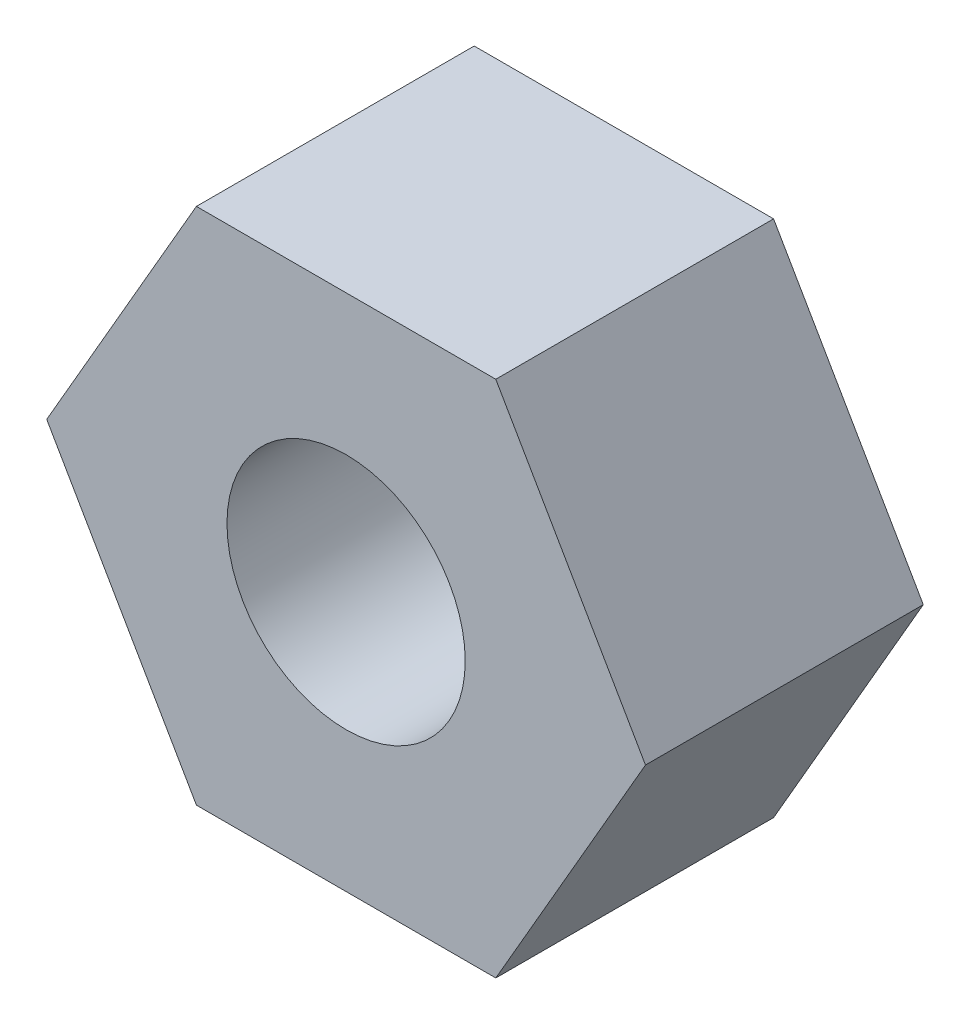
ISO-10303-21;
HEADER;
FILE_DESCRIPTION(('STEP AP214'),'2;1');
FILE_NAME('part.step','',(''),(''),'','','');
FILE_SCHEMA(('AUTOMOTIVE_DESIGN { 1 0 10303 214 1 1 1 1 }'));
ENDSEC;
DATA;
#1=APPLICATION_CONTEXT('core data for automotive mechanical design processes');
#2=APPLICATION_PROTOCOL_DEFINITION('international standard','automotive_design',2000,#1);
#3=PRODUCT_CONTEXT('',#1,'mechanical');
#4=PRODUCT('Part','Part','',(#3));
#5=PRODUCT_RELATED_PRODUCT_CATEGORY('part','',(#4));
#6=PRODUCT_DEFINITION_FORMATION('','',#4);
#7=PRODUCT_DEFINITION_CONTEXT('part definition',#1,'design');
#8=PRODUCT_DEFINITION('design','',#6,#7);
#9=PRODUCT_DEFINITION_SHAPE('','',#8);
#10=(LENGTH_UNIT() NAMED_UNIT(*) SI_UNIT(.MILLI.,.METRE.));
#11=(NAMED_UNIT(*) PLANE_ANGLE_UNIT() SI_UNIT($,.RADIAN.));
#12=(NAMED_UNIT(*) SI_UNIT($,.STERADIAN.) SOLID_ANGLE_UNIT());
#13=UNCERTAINTY_MEASURE_WITH_UNIT(LENGTH_MEASURE(1.E-05),#10,'distance_accuracy_value','');
#14=(GEOMETRIC_REPRESENTATION_CONTEXT(3) GLOBAL_UNCERTAINTY_ASSIGNED_CONTEXT((#13)) GLOBAL_UNIT_ASSIGNED_CONTEXT((#10,
#11,#12)) REPRESENTATION_CONTEXT('',''));
#15=CARTESIAN_POINT('',(0.,0.,0.));
#16=DIRECTION('',(0.,0.,1.));
#17=DIRECTION('',(1.,0.,0.));
#18=AXIS2_PLACEMENT_3D('',#15,#16,#17);
#19=CARTESIAN_POINT('',(-6.41580486636971,0.,5.953125));
#20=DIRECTION('',(0.866025403784439,0.5,0.));
#21=DIRECTION('',(-0.5,0.866025403784439,0.));
#22=AXIS2_PLACEMENT_3D('',#19,#20,#21);
#23=PLANE('',#22);
#24=DIRECTION('',(0.5,-0.866025403784439,0.));
#25=VECTOR('',#24,1.);
#26=CARTESIAN_POINT('',(-6.41580486636971,0.,0.));
#27=LINE('',#26,#25);
#28=CARTESIAN_POINT('',(-6.41580486636971,0.,0.));
#29=VERTEX_POINT('',#28);
#30=CARTESIAN_POINT('',(-3.20790243318486,-5.55625,0.));
#31=VERTEX_POINT('',#30);
#32=EDGE_CURVE('E119',#29,#31,#27,.T.);
#33=ORIENTED_EDGE('',*,*,#32,.T.);
#34=DIRECTION('',(0.,0.,-1.));
#35=VECTOR('',#34,1.);
#36=CARTESIAN_POINT('',(-3.20790243318486,-5.55625,5.953125));
#37=LINE('',#36,#35);
#38=CARTESIAN_POINT('',(-3.20790243318486,-5.55625,5.953125));
#39=VERTEX_POINT('',#38);
#40=EDGE_CURVE('E11',#39,#31,#37,.T.);
#41=ORIENTED_EDGE('',*,*,#40,.F.);
#42=DIRECTION('',(0.5,-0.866025403784439,0.));
#43=VECTOR('',#42,1.);
#44=CARTESIAN_POINT('',(-6.41580486636971,0.,5.953125));
#45=LINE('',#44,#43);
#46=CARTESIAN_POINT('',(-6.41580486636971,0.,5.953125));
#47=VERTEX_POINT('',#46);
#48=EDGE_CURVE('E130',#47,#39,#45,.T.);
#49=ORIENTED_EDGE('',*,*,#48,.F.);
#50=DIRECTION('',(0.,0.,-1.));
#51=VECTOR('',#50,1.);
#52=CARTESIAN_POINT('',(-6.41580486636971,0.,5.953125));
#53=LINE('',#52,#51);
#54=EDGE_CURVE('E115',#47,#29,#53,.T.);
#55=ORIENTED_EDGE('',*,*,#54,.T.);
#56=EDGE_LOOP('',(#33,#41,#49,#55));
#57=FACE_BOUND('',#56,.T.);
#58=ADVANCED_FACE('F35',(#57),#23,.F.);
#59=CARTESIAN_POINT('',(-3.20790243318486,-5.55625,5.953125));
#60=DIRECTION('',(0.,1.,0.));
#61=DIRECTION('',(0.,0.,1.));
#62=AXIS2_PLACEMENT_3D('',#59,#60,#61);
#63=PLANE('',#62);
#64=DIRECTION('',(1.,0.,0.));
#65=VECTOR('',#64,1.);
#66=CARTESIAN_POINT('',(-3.20790243318486,-5.55625,0.));
#67=LINE('',#66,#65);
#68=CARTESIAN_POINT('',(3.20790243318486,-5.55625,0.));
#69=VERTEX_POINT('',#68);
#70=EDGE_CURVE('E122',#31,#69,#67,.T.);
#71=ORIENTED_EDGE('',*,*,#70,.T.);
#72=DIRECTION('',(0.,0.,-1.));
#73=VECTOR('',#72,1.);
#74=CARTESIAN_POINT('',(3.20790243318486,-5.55625,5.953125));
#75=LINE('',#74,#73);
#76=CARTESIAN_POINT('',(3.20790243318486,-5.55625,5.953125));
#77=VERTEX_POINT('',#76);
#78=EDGE_CURVE('E43',#77,#69,#75,.T.);
#79=ORIENTED_EDGE('',*,*,#78,.F.);
#80=DIRECTION('',(1.,0.,0.));
#81=VECTOR('',#80,1.);
#82=CARTESIAN_POINT('',(-3.20790243318486,-5.55625,5.953125));
#83=LINE('',#82,#81);
#84=EDGE_CURVE('E88',#39,#77,#83,.T.);
#85=ORIENTED_EDGE('',*,*,#84,.F.);
#86=ORIENTED_EDGE('',*,*,#40,.T.);
#87=EDGE_LOOP('',(#71,#79,#85,#86));
#88=FACE_BOUND('',#87,.T.);
#89=ADVANCED_FACE('F155',(#88),#63,.F.);
#90=CARTESIAN_POINT('',(3.20790243318486,-5.55625,5.953125));
#91=DIRECTION('',(-0.866025403784439,0.5,0.));
#92=DIRECTION('',(-0.5,-0.866025403784439,0.));
#93=AXIS2_PLACEMENT_3D('',#90,#91,#92);
#94=PLANE('',#93);
#95=DIRECTION('',(0.5,0.866025403784439,0.));
#96=VECTOR('',#95,1.);
#97=CARTESIAN_POINT('',(3.20790243318486,-5.55625,0.));
#98=LINE('',#97,#96);
#99=CARTESIAN_POINT('',(6.41580486636972,0.,0.));
#100=VERTEX_POINT('',#99);
#101=EDGE_CURVE('E125',#69,#100,#98,.T.);
#102=ORIENTED_EDGE('',*,*,#101,.T.);
#103=DIRECTION('',(0.,0.,-1.));
#104=VECTOR('',#103,1.);
#105=CARTESIAN_POINT('',(6.41580486636972,0.,5.953125));
#106=LINE('',#105,#104);
#107=CARTESIAN_POINT('',(6.41580486636972,0.,5.953125));
#108=VERTEX_POINT('',#107);
#109=EDGE_CURVE('E110',#108,#100,#106,.T.);
#110=ORIENTED_EDGE('',*,*,#109,.F.);
#111=DIRECTION('',(0.5,0.866025403784439,0.));
#112=VECTOR('',#111,1.);
#113=CARTESIAN_POINT('',(3.20790243318486,-5.55625,5.953125));
#114=LINE('',#113,#112);
#115=EDGE_CURVE('E101',#77,#108,#114,.T.);
#116=ORIENTED_EDGE('',*,*,#115,.F.);
#117=ORIENTED_EDGE('',*,*,#78,.T.);
#118=EDGE_LOOP('',(#102,#110,#116,#117));
#119=FACE_BOUND('',#118,.T.);
#120=ADVANCED_FACE('F136',(#119),#94,.F.);
#121=CARTESIAN_POINT('',(6.41580486636972,0.,5.953125));
#122=DIRECTION('',(-0.866025403784438,-0.500000000000001,0.));
#123=DIRECTION('',(0.500000000000001,-0.866025403784438,0.));
#124=AXIS2_PLACEMENT_3D('',#121,#122,#123);
#125=PLANE('',#124);
#126=DIRECTION('',(-0.500000000000001,0.866025403784438,0.));
#127=VECTOR('',#126,1.);
#128=CARTESIAN_POINT('',(6.41580486636972,0.,0.));
#129=LINE('',#128,#127);
#130=CARTESIAN_POINT('',(3.20790243318486,5.55625,0.));
#131=VERTEX_POINT('',#130);
#132=EDGE_CURVE('E109',#100,#131,#129,.T.);
#133=ORIENTED_EDGE('',*,*,#132,.T.);
#134=DIRECTION('',(0.,0.,-1.));
#135=VECTOR('',#134,1.);
#136=CARTESIAN_POINT('',(3.20790243318486,5.55625,5.953125));
#137=LINE('',#136,#135);
#138=CARTESIAN_POINT('',(3.20790243318486,5.55625,5.953125));
#139=VERTEX_POINT('',#138);
#140=EDGE_CURVE('E106',#139,#131,#137,.T.);
#141=ORIENTED_EDGE('',*,*,#140,.F.);
#142=DIRECTION('',(-0.500000000000001,0.866025403784438,0.));
#143=VECTOR('',#142,1.);
#144=CARTESIAN_POINT('',(6.41580486636972,0.,5.953125));
#145=LINE('',#144,#143);
#146=EDGE_CURVE('E95',#108,#139,#145,.T.);
#147=ORIENTED_EDGE('',*,*,#146,.F.);
#148=ORIENTED_EDGE('',*,*,#109,.T.);
#149=EDGE_LOOP('',(#133,#141,#147,#148));
#150=FACE_BOUND('',#149,.T.);
#151=ADVANCED_FACE('F107',(#150),#125,.F.);
#152=CARTESIAN_POINT('',(3.20790243318486,5.55625,5.953125));
#153=DIRECTION('',(0.,-1.,0.));
#154=DIRECTION('',(1.,0.,0.));
#155=AXIS2_PLACEMENT_3D('',#152,#153,#154);
#156=PLANE('',#155);
#157=DIRECTION('',(-1.,0.,0.));
#158=VECTOR('',#157,1.);
#159=CARTESIAN_POINT('',(3.20790243318486,5.55625,0.));
#160=LINE('',#159,#158);
#161=CARTESIAN_POINT('',(-3.20790243318486,5.55625,0.));
#162=VERTEX_POINT('',#161);
#163=EDGE_CURVE('E74',#131,#162,#160,.T.);
#164=ORIENTED_EDGE('',*,*,#163,.T.);
#165=DIRECTION('',(0.,0.,-1.));
#166=VECTOR('',#165,1.);
#167=CARTESIAN_POINT('',(-3.20790243318486,5.55625,5.953125));
#168=LINE('',#167,#166);
#169=CARTESIAN_POINT('',(-3.20790243318486,5.55625,5.953125));
#170=VERTEX_POINT('',#169);
#171=EDGE_CURVE('E111',#170,#162,#168,.T.);
#172=ORIENTED_EDGE('',*,*,#171,.F.);
#173=DIRECTION('',(-1.,0.,0.));
#174=VECTOR('',#173,1.);
#175=CARTESIAN_POINT('',(3.20790243318486,5.55625,5.953125));
#176=LINE('',#175,#174);
#177=EDGE_CURVE('E99',#139,#170,#176,.T.);
#178=ORIENTED_EDGE('',*,*,#177,.F.);
#179=ORIENTED_EDGE('',*,*,#140,.T.);
#180=EDGE_LOOP('',(#164,#172,#178,#179));
#181=FACE_BOUND('',#180,.T.);
#182=ADVANCED_FACE('F113',(#181),#156,.F.);
#183=CARTESIAN_POINT('',(-3.20790243318486,5.55625,5.953125));
#184=DIRECTION('',(0.866025403784439,-0.499999999999999,0.));
#185=DIRECTION('',(0.499999999999999,0.866025403784439,0.));
#186=AXIS2_PLACEMENT_3D('',#183,#184,#185);
#187=PLANE('',#186);
#188=DIRECTION('',(-0.499999999999999,-0.866025403784439,0.));
#189=VECTOR('',#188,1.);
#190=CARTESIAN_POINT('',(-3.20790243318486,5.55625,0.));
#191=LINE('',#190,#189);
#192=EDGE_CURVE('E80',#162,#29,#191,.T.);
#193=ORIENTED_EDGE('',*,*,#192,.T.);
#194=ORIENTED_EDGE('',*,*,#54,.F.);
#195=DIRECTION('',(-0.499999999999999,-0.866025403784439,0.));
#196=VECTOR('',#195,1.);
#197=CARTESIAN_POINT('',(-3.20790243318486,5.55625,5.953125));
#198=LINE('',#197,#196);
#199=EDGE_CURVE('E51',#170,#47,#198,.T.);
#200=ORIENTED_EDGE('',*,*,#199,.F.);
#201=ORIENTED_EDGE('',*,*,#171,.T.);
#202=EDGE_LOOP('',(#193,#194,#200,#201));
#203=FACE_BOUND('',#202,.T.);
#204=ADVANCED_FACE('F143',(#203),#187,.F.);
#205=CARTESIAN_POINT('',(0.,0.,5.953125));
#206=DIRECTION('',(0.,0.,1.));
#207=DIRECTION('',(1.,0.,0.));
#208=AXIS2_PLACEMENT_3D('',#205,#206,#207);
#209=PLANE('',#208);
#210=CARTESIAN_POINT('',(0.,0.,5.953125));
#211=DIRECTION('',(0.,0.,1.));
#212=DIRECTION('',(1.,0.,0.));
#213=AXIS2_PLACEMENT_3D('',#210,#211,#212);
#214=CIRCLE('',#213,2.55269999999999);
#215=CARTESIAN_POINT('',(2.55269999999999,0.,5.953125));
#216=VERTEX_POINT('',#215);
#217=EDGE_CURVE('E212',#216,#216,#214,.T.);
#218=ORIENTED_EDGE('',*,*,#217,.F.);
#219=EDGE_LOOP('',(#218));
#220=FACE_BOUND('',#219,.T.);
#221=ORIENTED_EDGE('',*,*,#48,.T.);
#222=ORIENTED_EDGE('',*,*,#84,.T.);
#223=ORIENTED_EDGE('',*,*,#115,.T.);
#224=ORIENTED_EDGE('',*,*,#146,.T.);
#225=ORIENTED_EDGE('',*,*,#177,.T.);
#226=ORIENTED_EDGE('',*,*,#199,.T.);
#227=EDGE_LOOP('',(#221,#222,#223,#224,#225,#226));
#228=FACE_BOUND('',#227,.T.);
#229=ADVANCED_FACE('F97',(#220,#228),#209,.T.);
#230=CARTESIAN_POINT('',(0.,0.,0.));
#231=DIRECTION('',(0.,0.,1.));
#232=DIRECTION('',(1.,0.,0.));
#233=AXIS2_PLACEMENT_3D('',#230,#231,#232);
#234=PLANE('',#233);
#235=CARTESIAN_POINT('',(0.,0.,0.));
#236=DIRECTION('',(0.,0.,1.));
#237=DIRECTION('',(1.,0.,0.));
#238=AXIS2_PLACEMENT_3D('',#235,#236,#237);
#239=CIRCLE('',#238,2.5527);
#240=CARTESIAN_POINT('',(2.5527,0.,0.));
#241=VERTEX_POINT('',#240);
#242=EDGE_CURVE('E123',#241,#241,#239,.T.);
#243=ORIENTED_EDGE('',*,*,#242,.T.);
#244=EDGE_LOOP('',(#243));
#245=FACE_BOUND('',#244,.T.);
#246=ORIENTED_EDGE('',*,*,#32,.F.);
#247=ORIENTED_EDGE('',*,*,#192,.F.);
#248=ORIENTED_EDGE('',*,*,#163,.F.);
#249=ORIENTED_EDGE('',*,*,#132,.F.);
#250=ORIENTED_EDGE('',*,*,#101,.F.);
#251=ORIENTED_EDGE('',*,*,#70,.F.);
#252=EDGE_LOOP('',(#246,#247,#248,#249,#250,#251));
#253=FACE_BOUND('',#252,.T.);
#254=ADVANCED_FACE('F139',(#245,#253),#234,.F.);
#255=CARTESIAN_POINT('',(0.,0.,5.953125));
#256=DIRECTION('',(0.,0.,1.));
#257=DIRECTION('',(1.,0.,0.));
#258=AXIS2_PLACEMENT_3D('',#255,#256,#257);
#259=CYLINDRICAL_SURFACE('',#258,2.55269999999999);
#260=ORIENTED_EDGE('',*,*,#242,.F.);
#261=EDGE_LOOP('',(#260));
#262=FACE_BOUND('',#261,.T.);
#263=ORIENTED_EDGE('',*,*,#217,.T.);
#264=EDGE_LOOP('',(#263));
#265=FACE_BOUND('',#264,.T.);
#266=ADVANCED_FACE('F192',(#262,#265),#259,.F.);
#267=CLOSED_SHELL('',(#58,#89,#120,#151,#182,#204,#229,#254,#266));
#268=MANIFOLD_SOLID_BREP('B2',#267);
#269=ADVANCED_BREP_SHAPE_REPRESENTATION('',(#18,#268),#14);
#270=SHAPE_DEFINITION_REPRESENTATION(#9,#269);
ENDSEC;
END-ISO-10303-21;
